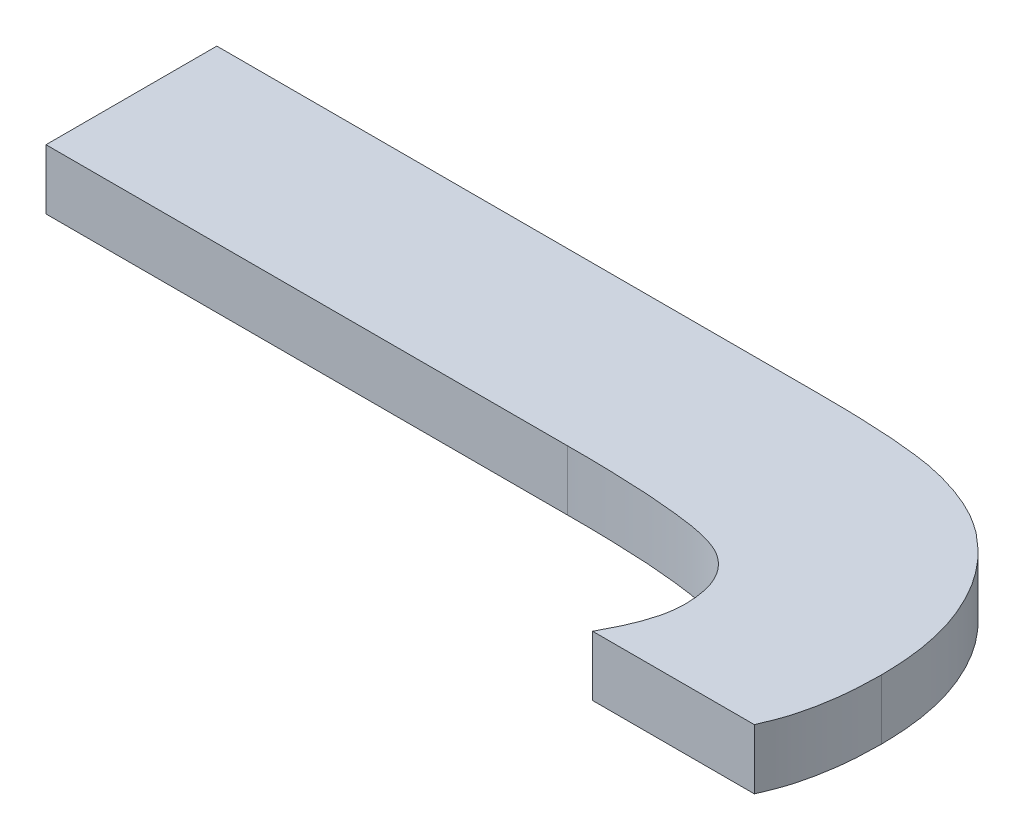
ISO-10303-21;
HEADER;
FILE_DESCRIPTION(('STEP AP214'),'2;1');
FILE_NAME('part.step','',(''),(''),'','','');
FILE_SCHEMA(('AUTOMOTIVE_DESIGN { 1 0 10303 214 1 1 1 1 }'));
ENDSEC;
DATA;
#1=APPLICATION_CONTEXT('core data for automotive mechanical design processes');
#2=APPLICATION_PROTOCOL_DEFINITION('international standard','automotive_design',2000,#1);
#3=PRODUCT_CONTEXT('',#1,'mechanical');
#4=PRODUCT('Part','Part','',(#3));
#5=PRODUCT_RELATED_PRODUCT_CATEGORY('part','',(#4));
#6=PRODUCT_DEFINITION_FORMATION('','',#4);
#7=PRODUCT_DEFINITION_CONTEXT('part definition',#1,'design');
#8=PRODUCT_DEFINITION('design','',#6,#7);
#9=PRODUCT_DEFINITION_SHAPE('','',#8);
#10=(LENGTH_UNIT() NAMED_UNIT(*) SI_UNIT(.MILLI.,.METRE.));
#11=(NAMED_UNIT(*) PLANE_ANGLE_UNIT() SI_UNIT($,.RADIAN.));
#12=(NAMED_UNIT(*) SI_UNIT($,.STERADIAN.) SOLID_ANGLE_UNIT());
#13=UNCERTAINTY_MEASURE_WITH_UNIT(LENGTH_MEASURE(1.E-05),#10,'distance_accuracy_value','');
#14=(GEOMETRIC_REPRESENTATION_CONTEXT(3) GLOBAL_UNCERTAINTY_ASSIGNED_CONTEXT((#13)) GLOBAL_UNIT_ASSIGNED_CONTEXT((#10,
#11,#12)) REPRESENTATION_CONTEXT('',''));
#15=CARTESIAN_POINT('',(0.,0.,0.));
#16=DIRECTION('',(0.,0.,1.));
#17=DIRECTION('',(1.,0.,0.));
#18=AXIS2_PLACEMENT_3D('',#15,#16,#17);
#19=CARTESIAN_POINT('',(2.55,2.9956,3.3134212662338));
#20=CARTESIAN_POINT('',(2.55,2.9306,3.3134212662338));
#21=CARTESIAN_POINT('',(2.5497738477725,2.9956,3.3242334318502));
#22=CARTESIAN_POINT('',(2.5497738477725,2.9306,3.3242334318502));
#23=CARTESIAN_POINT('',(2.5493331390078,2.9956,3.3453033819643));
#24=CARTESIAN_POINT('',(2.5493331390078,2.9306,3.3453033819643));
#25=CARTESIAN_POINT('',(2.5449993435722,2.9956,3.3755794132263));
#26=CARTESIAN_POINT('',(2.5449993435722,2.9306,3.3755794132263));
#27=CARTESIAN_POINT('',(2.5383596005113,2.9956,3.4035173618713));
#28=CARTESIAN_POINT('',(2.5383596005113,2.9306,3.4035173618713));
#29=CARTESIAN_POINT('',(2.5312649905346,2.9956,3.4204869664525));
#30=CARTESIAN_POINT('',(2.5312649905346,2.9306,3.4204869664525));
#31=CARTESIAN_POINT('',(2.527830762987,2.9956,3.4287012987013));
#32=CARTESIAN_POINT('',(2.527830762987,2.9306,3.4287012987013));
#33=B_SPLINE_SURFACE_WITH_KNOTS('',3,1,((#19,#20),(#21,#22),(#23,#24),(#25,#26),(#27,#28),(#29,
#30),(#31,#32)),.UNSPECIFIED.,.F.,.F.,.F.,(4,1,1,1,4),(2,2),(0.,0.274083863078505,
0.534114397341478,0.774482716327897,1.),(0.,1.),.UNSPECIFIED.);
#34=CARTESIAN_POINT('',(2.55,2.9306,3.3134212662338));
#35=CARTESIAN_POINT('',(2.5497738477725,2.9306,3.3242334318502));
#36=CARTESIAN_POINT('',(2.5493331390078,2.9306,3.3453033819643));
#37=CARTESIAN_POINT('',(2.5449993435722,2.9306,3.3755794132263));
#38=CARTESIAN_POINT('',(2.5383596005113,2.9306,3.4035173618713));
#39=CARTESIAN_POINT('',(2.5312649905346,2.9306,3.4204869664525));
#40=CARTESIAN_POINT('',(2.527830762987,2.9306,3.4287012987013));
#41=B_SPLINE_CURVE_WITH_KNOTS('',3,(#34,#35,#36,#37,#38,#39,#40),.UNSPECIFIED.,.F.,.F.,(4,1,1,1,
4),(0.,0.274083863078505,0.534114397341478,0.774482716327897,1.),.UNSPECIFIED.);
#42=CARTESIAN_POINT('',(2.55,2.9306,3.3134212662338));
#43=VERTEX_POINT('',#42);
#44=CARTESIAN_POINT('',(2.527830762987,2.9306,3.4287012987013));
#45=VERTEX_POINT('',#44);
#46=EDGE_CURVE('E11',#43,#45,#41,.T.);
#47=DIRECTION('',(0.,-1.,0.));
#48=VECTOR('',#47,1.);
#49=CARTESIAN_POINT('',(2.55,2.9956,3.3134212662338));
#50=LINE('',#49,#48);
#51=CARTESIAN_POINT('',(2.55,2.9956,3.3134212662338));
#52=VERTEX_POINT('',#51);
#53=EDGE_CURVE('E28',#52,#43,#50,.T.);
#54=CARTESIAN_POINT('',(2.55,2.9956,3.3134212662338));
#55=CARTESIAN_POINT('',(2.5497738477725,2.9956,3.3242334318502));
#56=CARTESIAN_POINT('',(2.5493331390078,2.9956,3.3453033819643));
#57=CARTESIAN_POINT('',(2.5449993435722,2.9956,3.3755794132263));
#58=CARTESIAN_POINT('',(2.5383596005113,2.9956,3.4035173618713));
#59=CARTESIAN_POINT('',(2.5312649905346,2.9956,3.4204869664525));
#60=CARTESIAN_POINT('',(2.527830762987,2.9956,3.4287012987013));
#61=B_SPLINE_CURVE_WITH_KNOTS('',3,(#54,#55,#56,#57,#58,#59,#60),.UNSPECIFIED.,.F.,.F.,(4,1,1,1,
4),(0.,0.274083863078505,0.534114397341478,0.774482716327897,1.),.UNSPECIFIED.);
#62=CARTESIAN_POINT('',(2.527830762987,2.9956,3.4287012987013));
#63=VERTEX_POINT('',#62);
#64=EDGE_CURVE('E208',#52,#63,#61,.T.);
#65=DIRECTION('',(0.,-1.,0.));
#66=VECTOR('',#65,1.);
#67=CARTESIAN_POINT('',(2.527830762987,2.9956,3.4287012987013));
#68=LINE('',#67,#66);
#69=EDGE_CURVE('E112',#63,#45,#68,.T.);
#70=ORIENTED_EDGE('',*,*,#46,.F.);
#71=ORIENTED_EDGE('',*,*,#53,.F.);
#72=ORIENTED_EDGE('',*,*,#64,.T.);
#73=ORIENTED_EDGE('',*,*,#69,.T.);
#74=EDGE_LOOP('',(#70,#71,#72,#73));
#75=FACE_BOUND('',#74,.T.);
#76=ADVANCED_FACE('F17',(#75),#33,.T.);
#77=CARTESIAN_POINT('',(2.4678774350649,2.9956,3.1285491071429));
#78=CARTESIAN_POINT('',(2.4678774350649,2.9306,3.1285491071429));
#79=CARTESIAN_POINT('',(2.4743191460447,2.9956,3.1339870852728));
#80=CARTESIAN_POINT('',(2.4743191460447,2.9306,3.1339870852728));
#81=CARTESIAN_POINT('',(2.4871331745617,2.9956,3.1448044608196));
#82=CARTESIAN_POINT('',(2.4871331745617,2.9306,3.1448044608196));
#83=CARTESIAN_POINT('',(2.5037491170381,2.9956,3.1637072406119));
#84=CARTESIAN_POINT('',(2.5037491170381,2.9306,3.1637072406119));
#85=CARTESIAN_POINT('',(2.5179095832179,2.9956,3.1844372915379));
#86=CARTESIAN_POINT('',(2.5179095832179,2.9306,3.1844372915379));
#87=CARTESIAN_POINT('',(2.5294765633289,2.9956,3.2070220364225));
#88=CARTESIAN_POINT('',(2.5294765633289,2.9306,3.2070220364225));
#89=CARTESIAN_POINT('',(2.5388495601437,2.9956,3.231206065738));
#90=CARTESIAN_POINT('',(2.5388495601437,2.9306,3.231206065738));
#91=CARTESIAN_POINT('',(2.5453179605092,2.9956,3.2571736884856));
#92=CARTESIAN_POINT('',(2.5453179605092,2.9306,3.2571736884856));
#93=CARTESIAN_POINT('',(2.5492316871639,2.9956,3.2847710122562));
#94=CARTESIAN_POINT('',(2.5492316871639,2.9306,3.2847710122562));
#95=CARTESIAN_POINT('',(2.5497394366337,2.9956,3.3037049029635));
#96=CARTESIAN_POINT('',(2.5497394366337,2.9306,3.3037049029635));
#97=CARTESIAN_POINT('',(2.55,2.9956,3.3134212662338));
#98=CARTESIAN_POINT('',(2.55,2.9306,3.3134212662338));
#99=B_SPLINE_SURFACE_WITH_KNOTS('',3,1,((#77,#78),(#79,#80),(#81,#82),(#83,#84),(#85,#86),(#87,
#88),(#89,#90),(#91,#92),(#93,#94),(#95,#96),(#97,#98)),.UNSPECIFIED.,.F.,.F.,.F.,(4,1,1,1,1,1,
1,1,4),(2,2),(0.,0.120499939259771,0.239701790845742,0.358807845235199,0.478896598669107,
0.60202033229508,0.729141189105166,0.861002546053464,1.),(0.,1.),.UNSPECIFIED.);
#100=CARTESIAN_POINT('',(2.4678774350649,2.9306,3.1285491071429));
#101=CARTESIAN_POINT('',(2.4743191460447,2.9306,3.1339870852728));
#102=CARTESIAN_POINT('',(2.4871331745617,2.9306,3.1448044608196));
#103=CARTESIAN_POINT('',(2.5037491170381,2.9306,3.1637072406119));
#104=CARTESIAN_POINT('',(2.5179095832179,2.9306,3.1844372915379));
#105=CARTESIAN_POINT('',(2.5294765633289,2.9306,3.2070220364225));
#106=CARTESIAN_POINT('',(2.5388495601437,2.9306,3.231206065738));
#107=CARTESIAN_POINT('',(2.5453179605092,2.9306,3.2571736884856));
#108=CARTESIAN_POINT('',(2.5492316871639,2.9306,3.2847710122562));
#109=CARTESIAN_POINT('',(2.5497394366337,2.9306,3.3037049029635));
#110=CARTESIAN_POINT('',(2.55,2.9306,3.3134212662338));
#111=B_SPLINE_CURVE_WITH_KNOTS('',3,(#100,#101,#102,#103,#104,#105,#106,#107,#108,#109,#110),
.UNSPECIFIED.,.F.,.F.,(4,1,1,1,1,1,1,1,4),(0.,0.120499939259771,0.239701790845742,
0.358807845235199,0.478896598669107,0.60202033229508,0.729141189105166,0.861002546053464,1.),.UNSPECIFIED.);
#112=CARTESIAN_POINT('',(2.4678774350649,2.9306,3.1285491071429));
#113=VERTEX_POINT('',#112);
#114=EDGE_CURVE('E200',#113,#43,#111,.T.);
#115=DIRECTION('',(0.,-1.,0.));
#116=VECTOR('',#115,1.);
#117=CARTESIAN_POINT('',(2.4678774350649,2.9956,3.1285491071429));
#118=LINE('',#117,#116);
#119=CARTESIAN_POINT('',(2.4678774350649,2.9956,3.1285491071429));
#120=VERTEX_POINT('',#119);
#121=EDGE_CURVE('E194',#120,#113,#118,.T.);
#122=CARTESIAN_POINT('',(2.4678774350649,2.9956,3.1285491071429));
#123=CARTESIAN_POINT('',(2.4743191460447,2.9956,3.1339870852728));
#124=CARTESIAN_POINT('',(2.4871331745617,2.9956,3.1448044608196));
#125=CARTESIAN_POINT('',(2.5037491170381,2.9956,3.1637072406119));
#126=CARTESIAN_POINT('',(2.5179095832179,2.9956,3.1844372915379));
#127=CARTESIAN_POINT('',(2.5294765633289,2.9956,3.2070220364225));
#128=CARTESIAN_POINT('',(2.5388495601437,2.9956,3.231206065738));
#129=CARTESIAN_POINT('',(2.5453179605092,2.9956,3.2571736884856));
#130=CARTESIAN_POINT('',(2.5492316871639,2.9956,3.2847710122562));
#131=CARTESIAN_POINT('',(2.5497394366337,2.9956,3.3037049029635));
#132=CARTESIAN_POINT('',(2.55,2.9956,3.3134212662338));
#133=B_SPLINE_CURVE_WITH_KNOTS('',3,(#122,#123,#124,#125,#126,#127,#128,#129,#130,#131,#132),
.UNSPECIFIED.,.F.,.F.,(4,1,1,1,1,1,1,1,4),(0.,0.120499939259771,0.239701790845742,
0.358807845235199,0.478896598669107,0.60202033229508,0.729141189105166,0.861002546053464,1.),.UNSPECIFIED.);
#134=EDGE_CURVE('E186',#120,#52,#133,.T.);
#135=ORIENTED_EDGE('',*,*,#114,.F.);
#136=ORIENTED_EDGE('',*,*,#121,.F.);
#137=ORIENTED_EDGE('',*,*,#134,.T.);
#138=ORIENTED_EDGE('',*,*,#53,.T.);
#139=EDGE_LOOP('',(#135,#136,#137,#138));
#140=FACE_BOUND('',#139,.T.);
#141=ADVANCED_FACE('F215',(#140),#99,.T.);
#142=CARTESIAN_POINT('',(2.2486911525974,2.9956,3.0832467532468));
#143=CARTESIAN_POINT('',(2.2486911525974,2.9306,3.0832467532468));
#144=CARTESIAN_POINT('',(2.2565303119496,2.9956,3.0833092628335));
#145=CARTESIAN_POINT('',(2.2565303119496,2.9306,3.0833092628335));
#146=CARTESIAN_POINT('',(2.2716312252471,2.9956,3.0834296777667));
#147=CARTESIAN_POINT('',(2.2716312252471,2.9306,3.0834296777667));
#148=CARTESIAN_POINT('',(2.2934927693526,2.9956,3.0836321314618));
#149=CARTESIAN_POINT('',(2.2934927693526,2.9306,3.0836321314618));
#150=CARTESIAN_POINT('',(2.3136541484801,2.9956,3.0848295199475));
#151=CARTESIAN_POINT('',(2.3136541484801,2.9306,3.0848295199475));
#152=CARTESIAN_POINT('',(2.3322558074335,2.9956,3.0855383932958));
#153=CARTESIAN_POINT('',(2.3322558074335,2.9306,3.0855383932958));
#154=CARTESIAN_POINT('',(2.3491430171471,2.9956,3.0872146790696));
#155=CARTESIAN_POINT('',(2.3491430171471,2.9306,3.0872146790696));
#156=CARTESIAN_POINT('',(2.3644590518641,2.9956,3.0888613273748));
#157=CARTESIAN_POINT('',(2.3644590518641,2.9306,3.0888613273748));
#158=CARTESIAN_POINT('',(2.3781067337934,2.9956,3.0909327495814));
#159=CARTESIAN_POINT('',(2.3781067337934,2.9306,3.0909327495814));
#160=CARTESIAN_POINT('',(2.3939409895835,2.9956,3.0942561483369));
#161=CARTESIAN_POINT('',(2.3939409895835,2.9306,3.0942561483369));
#162=CARTESIAN_POINT('',(2.4119544457882,2.9956,3.099435261028));
#163=CARTESIAN_POINT('',(2.4119544457882,2.9306,3.099435261028));
#164=CARTESIAN_POINT('',(2.4322224741531,2.9956,3.1071288007434));
#165=CARTESIAN_POINT('',(2.4322224741531,2.9306,3.1071288007434));
#166=CARTESIAN_POINT('',(2.4510054390737,2.9956,3.1166423314599));
#167=CARTESIAN_POINT('',(2.4510054390737,2.9306,3.1166423314599));
#168=CARTESIAN_POINT('',(2.4623091511469,2.9956,3.1246195004985));
#169=CARTESIAN_POINT('',(2.4623091511469,2.9306,3.1246195004985));
#170=CARTESIAN_POINT('',(2.4678774350649,2.9956,3.1285491071429));
#171=CARTESIAN_POINT('',(2.4678774350649,2.9306,3.1285491071429));
#172=B_SPLINE_SURFACE_WITH_KNOTS('',3,1,((#142,#143),(#144,#145),(#146,#147),(#148,#149),(#150,
#151),(#152,#153),(#154,#155),(#156,#157),(#158,#159),(#160,#161),(#162,#163),(#164,#165),(#166,
#167),(#168,#169),(#170,#171)),.UNSPECIFIED.,.F.,.F.,.F.,(4,1,1,1,1,1,1,1,1,1,1,1,4),(2,2),(0.,
0.103189947433387,0.198779279685321,0.287687949097263,0.368993923108795,0.443730443517813,
0.510980122796107,0.571747707053025,0.625327070740927,0.72384627359423,0.818090298132923,
0.910390068247318,1.),(0.,1.),.UNSPECIFIED.);
#173=CARTESIAN_POINT('',(2.2486911525974,2.9306,3.0832467532468));
#174=CARTESIAN_POINT('',(2.2565303119496,2.9306,3.0833092628335));
#175=CARTESIAN_POINT('',(2.2716312252471,2.9306,3.0834296777667));
#176=CARTESIAN_POINT('',(2.2934927693526,2.9306,3.0836321314618));
#177=CARTESIAN_POINT('',(2.3136541484801,2.9306,3.0848295199475));
#178=CARTESIAN_POINT('',(2.3322558074335,2.9306,3.0855383932958));
#179=CARTESIAN_POINT('',(2.3491430171471,2.9306,3.0872146790696));
#180=CARTESIAN_POINT('',(2.3644590518641,2.9306,3.0888613273748));
#181=CARTESIAN_POINT('',(2.3781067337934,2.9306,3.0909327495814));
#182=CARTESIAN_POINT('',(2.3939409895835,2.9306,3.0942561483369));
#183=CARTESIAN_POINT('',(2.4119544457882,2.9306,3.099435261028));
#184=CARTESIAN_POINT('',(2.4322224741531,2.9306,3.1071288007434));
#185=CARTESIAN_POINT('',(2.4510054390737,2.9306,3.1166423314599));
#186=CARTESIAN_POINT('',(2.4623091511469,2.9306,3.1246195004985));
#187=CARTESIAN_POINT('',(2.4678774350649,2.9306,3.1285491071429));
#188=B_SPLINE_CURVE_WITH_KNOTS('',3,(#173,#174,#175,#176,#177,#178,#179,#180,#181,#182,#183,
#184,#185,#186,#187),.UNSPECIFIED.,.F.,.F.,(4,1,1,1,1,1,1,1,1,1,1,1,4),(0.,0.103189947433387,
0.198779279685321,0.287687949097263,0.368993923108795,0.443730443517813,0.510980122796107,
0.571747707053025,0.625327070740927,0.72384627359423,0.818090298132923,0.910390068247318,1.),.UNSPECIFIED.);
#189=CARTESIAN_POINT('',(2.2486911525974,2.9306,3.0832467532468));
#190=VERTEX_POINT('',#189);
#191=EDGE_CURVE('E181',#190,#113,#188,.T.);
#192=DIRECTION('',(0.,-1.,0.));
#193=VECTOR('',#192,1.);
#194=CARTESIAN_POINT('',(2.2486911525974,2.9956,3.0832467532468));
#195=LINE('',#194,#193);
#196=CARTESIAN_POINT('',(2.2486911525974,2.9956,3.0832467532468));
#197=VERTEX_POINT('',#196);
#198=EDGE_CURVE('E175',#197,#190,#195,.T.);
#199=CARTESIAN_POINT('',(2.2486911525974,2.9956,3.0832467532468));
#200=CARTESIAN_POINT('',(2.2565303119496,2.9956,3.0833092628335));
#201=CARTESIAN_POINT('',(2.2716312252471,2.9956,3.0834296777667));
#202=CARTESIAN_POINT('',(2.2934927693526,2.9956,3.0836321314618));
#203=CARTESIAN_POINT('',(2.3136541484801,2.9956,3.0848295199475));
#204=CARTESIAN_POINT('',(2.3322558074335,2.9956,3.0855383932958));
#205=CARTESIAN_POINT('',(2.3491430171471,2.9956,3.0872146790696));
#206=CARTESIAN_POINT('',(2.3644590518641,2.9956,3.0888613273748));
#207=CARTESIAN_POINT('',(2.3781067337934,2.9956,3.0909327495814));
#208=CARTESIAN_POINT('',(2.3939409895835,2.9956,3.0942561483369));
#209=CARTESIAN_POINT('',(2.4119544457882,2.9956,3.099435261028));
#210=CARTESIAN_POINT('',(2.4322224741531,2.9956,3.1071288007434));
#211=CARTESIAN_POINT('',(2.4510054390737,2.9956,3.1166423314599));
#212=CARTESIAN_POINT('',(2.4623091511469,2.9956,3.1246195004985));
#213=CARTESIAN_POINT('',(2.4678774350649,2.9956,3.1285491071429));
#214=B_SPLINE_CURVE_WITH_KNOTS('',3,(#199,#200,#201,#202,#203,#204,#205,#206,#207,#208,#209,
#210,#211,#212,#213),.UNSPECIFIED.,.F.,.F.,(4,1,1,1,1,1,1,1,1,1,1,1,4),(0.,0.103189947433387,
0.198779279685321,0.287687949097263,0.368993923108795,0.443730443517813,0.510980122796107,
0.571747707053025,0.625327070740927,0.72384627359423,0.818090298132923,0.910390068247318,1.),.UNSPECIFIED.);
#215=EDGE_CURVE('E170',#197,#120,#214,.T.);
#216=ORIENTED_EDGE('',*,*,#191,.F.);
#217=ORIENTED_EDGE('',*,*,#198,.F.);
#218=ORIENTED_EDGE('',*,*,#215,.T.);
#219=ORIENTED_EDGE('',*,*,#121,.T.);
#220=EDGE_LOOP('',(#216,#217,#218,#219));
#221=FACE_BOUND('',#220,.T.);
#222=ADVANCED_FACE('F219',(#221),#172,.T.);
#223=CARTESIAN_POINT('',(1.6,2.9956,3.0832467532468));
#224=DIRECTION('',(0.,0.,-1.));
#225=DIRECTION('',(0.,1.,0.));
#226=AXIS2_PLACEMENT_3D('',#223,#224,#225);
#227=PLANE('',#226);
#228=DIRECTION('',(1.,0.,0.));
#229=VECTOR('',#228,1.);
#230=CARTESIAN_POINT('',(1.6,2.9306,3.0832467532468));
#231=LINE('',#230,#229);
#232=CARTESIAN_POINT('',(1.6,2.9306,3.0832467532468));
#233=VERTEX_POINT('',#232);
#234=EDGE_CURVE('E167',#233,#190,#231,.T.);
#235=ORIENTED_EDGE('',*,*,#234,.F.);
#236=DIRECTION('',(0.,-1.,0.));
#237=VECTOR('',#236,1.);
#238=CARTESIAN_POINT('',(1.6,2.9956,3.0832467532468));
#239=LINE('',#238,#237);
#240=CARTESIAN_POINT('',(1.6,2.9956,3.0832467532468));
#241=VERTEX_POINT('',#240);
#242=EDGE_CURVE('E164',#241,#233,#239,.T.);
#243=ORIENTED_EDGE('',*,*,#242,.F.);
#244=DIRECTION('',(1.,0.,0.));
#245=VECTOR('',#244,1.);
#246=CARTESIAN_POINT('',(1.6,2.9956,3.0832467532468));
#247=LINE('',#246,#245);
#248=EDGE_CURVE('E161',#241,#197,#247,.T.);
#249=ORIENTED_EDGE('',*,*,#248,.T.);
#250=ORIENTED_EDGE('',*,*,#198,.T.);
#251=EDGE_LOOP('',(#235,#243,#249,#250));
#252=FACE_BOUND('',#251,.T.);
#253=ADVANCED_FACE('F222',(#252),#227,.T.);
#254=CARTESIAN_POINT('',(1.6,2.9956,3.2683116883117));
#255=DIRECTION('',(-1.,0.,0.));
#256=DIRECTION('',(0.,1.,0.));
#257=AXIS2_PLACEMENT_3D('',#254,#255,#256);
#258=PLANE('',#257);
#259=DIRECTION('',(0.,0.,-1.));
#260=VECTOR('',#259,1.);
#261=CARTESIAN_POINT('',(1.6,2.9306,3.2683116883117));
#262=LINE('',#261,#260);
#263=CARTESIAN_POINT('',(1.6,2.9306,3.2683116883117));
#264=VERTEX_POINT('',#263);
#265=EDGE_CURVE('E158',#264,#233,#262,.T.);
#266=ORIENTED_EDGE('',*,*,#265,.F.);
#267=DIRECTION('',(0.,-1.,0.));
#268=VECTOR('',#267,1.);
#269=CARTESIAN_POINT('',(1.6,2.9956,3.2683116883117));
#270=LINE('',#269,#268);
#271=CARTESIAN_POINT('',(1.6,2.9956,3.2683116883117));
#272=VERTEX_POINT('',#271);
#273=EDGE_CURVE('E155',#272,#264,#270,.T.);
#274=ORIENTED_EDGE('',*,*,#273,.F.);
#275=DIRECTION('',(0.,0.,-1.));
#276=VECTOR('',#275,1.);
#277=CARTESIAN_POINT('',(1.6,2.9956,3.2683116883117));
#278=LINE('',#277,#276);
#279=EDGE_CURVE('E152',#272,#241,#278,.T.);
#280=ORIENTED_EDGE('',*,*,#279,.T.);
#281=ORIENTED_EDGE('',*,*,#242,.T.);
#282=EDGE_LOOP('',(#266,#274,#280,#281));
#283=FACE_BOUND('',#282,.T.);
#284=ADVANCED_FACE('F226',(#283),#258,.T.);
#285=CARTESIAN_POINT('',(2.1652191558442,2.9956,3.2683116883117));
#286=DIRECTION('',(0.,0.,1.));
#287=DIRECTION('',(0.,-1.,0.));
#288=AXIS2_PLACEMENT_3D('',#285,#286,#287);
#289=PLANE('',#288);
#290=DIRECTION('',(-1.,0.,0.));
#291=VECTOR('',#290,1.);
#292=CARTESIAN_POINT('',(2.1652191558442,2.9306,3.2683116883117));
#293=LINE('',#292,#291);
#294=CARTESIAN_POINT('',(2.1652191558442,2.9306,3.2683116883117));
#295=VERTEX_POINT('',#294);
#296=EDGE_CURVE('E149',#295,#264,#293,.T.);
#297=ORIENTED_EDGE('',*,*,#296,.F.);
#298=DIRECTION('',(0.,-1.,0.));
#299=VECTOR('',#298,1.);
#300=CARTESIAN_POINT('',(2.1652191558442,2.9956,3.2683116883117));
#301=LINE('',#300,#299);
#302=CARTESIAN_POINT('',(2.1652191558442,2.9956,3.2683116883117));
#303=VERTEX_POINT('',#302);
#304=EDGE_CURVE('E146',#303,#295,#301,.T.);
#305=ORIENTED_EDGE('',*,*,#304,.F.);
#306=DIRECTION('',(-1.,0.,0.));
#307=VECTOR('',#306,1.);
#308=CARTESIAN_POINT('',(2.1652191558442,2.9956,3.2683116883117));
#309=LINE('',#308,#307);
#310=EDGE_CURVE('E140',#303,#272,#309,.T.);
#311=ORIENTED_EDGE('',*,*,#310,.T.);
#312=ORIENTED_EDGE('',*,*,#273,.T.);
#313=EDGE_LOOP('',(#297,#305,#311,#312));
#314=FACE_BOUND('',#313,.T.);
#315=ADVANCED_FACE('F228',(#314),#289,.T.);
#316=CARTESIAN_POINT('',(2.3772727272727,2.9956,3.3539042207792));
#317=CARTESIAN_POINT('',(2.3772727272727,2.9306,3.3539042207792));
#318=CARTESIAN_POINT('',(2.3771545256871,2.9956,3.3499790381662));
#319=CARTESIAN_POINT('',(2.3771545256871,2.9306,3.3499790381662));
#320=CARTESIAN_POINT('',(2.3769268418107,2.9956,3.3424182191803));
#321=CARTESIAN_POINT('',(2.3769268418107,2.9306,3.3424182191803));
#322=CARTESIAN_POINT('',(2.3753848534838,2.9956,3.3314840731211));
#323=CARTESIAN_POINT('',(2.3753848534838,2.9306,3.3314840731211));
#324=CARTESIAN_POINT('',(2.3727871750898,2.9956,3.3214595724361));
#325=CARTESIAN_POINT('',(2.3727871750898,2.9306,3.3214595724361));
#326=CARTESIAN_POINT('',(2.3688330331462,2.9956,3.3124920516251));
#327=CARTESIAN_POINT('',(2.3688330331462,2.9306,3.3124920516251));
#328=CARTESIAN_POINT('',(2.3640228656121,2.9956,3.304418886642));
#329=CARTESIAN_POINT('',(2.3640228656121,2.9306,3.304418886642));
#330=CARTESIAN_POINT('',(2.3579520873319,2.9956,3.2974591635165));
#331=CARTESIAN_POINT('',(2.3579520873319,2.9306,3.2974591635165));
#332=CARTESIAN_POINT('',(2.3509126241766,2.9956,3.2913716292753));
#333=CARTESIAN_POINT('',(2.3509126241766,2.9306,3.2913716292753));
#334=CARTESIAN_POINT('',(2.3423985963194,2.9956,3.2860705919726));
#335=CARTESIAN_POINT('',(2.3423985963194,2.9306,3.2860705919726));
#336=CARTESIAN_POINT('',(2.3314696174775,2.9956,3.2818786611108));
#337=CARTESIAN_POINT('',(2.3314696174775,2.9306,3.2818786611108));
#338=CARTESIAN_POINT('',(2.3177469077157,2.9956,3.2780411426612));
#339=CARTESIAN_POINT('',(2.3177469077157,2.9306,3.2780411426612));
#340=CARTESIAN_POINT('',(2.3005574428477,2.9956,3.2751025814297));
#341=CARTESIAN_POINT('',(2.3005574428477,2.9306,3.2751025814297));
#342=CARTESIAN_POINT('',(2.2800196922305,2.9956,3.2727473985971));
#343=CARTESIAN_POINT('',(2.2800196922305,2.9306,3.2727473985971));
#344=CARTESIAN_POINT('',(2.2561177279651,2.9956,3.2705261147333));
#345=CARTESIAN_POINT('',(2.2561177279651,2.9306,3.2705261147333));
#346=CARTESIAN_POINT('',(2.2288423226587,2.9956,3.269400701635));
#347=CARTESIAN_POINT('',(2.2288423226587,2.9306,3.269400701635));
#348=CARTESIAN_POINT('',(2.1981928001753,2.9956,3.2682813817341));
#349=CARTESIAN_POINT('',(2.1981928001753,2.9306,3.2682813817341));
#350=CARTESIAN_POINT('',(2.1765943407781,2.9956,3.2683012332063));
#351=CARTESIAN_POINT('',(2.1765943407781,2.9306,3.2683012332063));
#352=CARTESIAN_POINT('',(2.1652191558442,2.9956,3.2683116883117));
#353=CARTESIAN_POINT('',(2.1652191558442,2.9306,3.2683116883117));
#354=B_SPLINE_SURFACE_WITH_KNOTS('',3,1,((#316,#317),(#318,#319),(#320,#321),(#322,#323),(#324,
#325),(#326,#327),(#328,#329),(#330,#331),(#332,#333),(#334,#335),(#336,#337),(#338,#339),(#340,
#341),(#342,#343),(#344,#345),(#346,#347),(#348,#349),(#350,#351),(#352,#353)),.UNSPECIFIED.,
.F.,.F.,.F.,(4,1,1,1,1,1,1,1,1,1,1,1,1,1,1,1,4),(2,2),(0.,0.0454035573864295,0.0874578618515766,
0.127492366968012,0.16478222962574,0.20048197486491,0.235800393089218,0.271118811313527,
0.307841153961921,0.351189738792344,0.406026882839916,0.472520576601945,0.552651685262186,
0.645198032484068,0.75014964479342,0.868412188849988,1.),(0.,1.),.UNSPECIFIED.);
#355=CARTESIAN_POINT('',(2.3772727272727,2.9306,3.3539042207792));
#356=CARTESIAN_POINT('',(2.3771545256871,2.9306,3.3499790381662));
#357=CARTESIAN_POINT('',(2.3769268418107,2.9306,3.3424182191803));
#358=CARTESIAN_POINT('',(2.3753848534838,2.9306,3.3314840731211));
#359=CARTESIAN_POINT('',(2.3727871750898,2.9306,3.3214595724361));
#360=CARTESIAN_POINT('',(2.3688330331462,2.9306,3.3124920516251));
#361=CARTESIAN_POINT('',(2.3640228656121,2.9306,3.304418886642));
#362=CARTESIAN_POINT('',(2.3579520873319,2.9306,3.2974591635165));
#363=CARTESIAN_POINT('',(2.3509126241766,2.9306,3.2913716292753));
#364=CARTESIAN_POINT('',(2.3423985963194,2.9306,3.2860705919726));
#365=CARTESIAN_POINT('',(2.3314696174775,2.9306,3.2818786611108));
#366=CARTESIAN_POINT('',(2.3177469077157,2.9306,3.2780411426612));
#367=CARTESIAN_POINT('',(2.3005574428477,2.9306,3.2751025814297));
#368=CARTESIAN_POINT('',(2.2800196922305,2.9306,3.2727473985971));
#369=CARTESIAN_POINT('',(2.2561177279651,2.9306,3.2705261147333));
#370=CARTESIAN_POINT('',(2.2288423226587,2.9306,3.269400701635));
#371=CARTESIAN_POINT('',(2.1981928001753,2.9306,3.2682813817341));
#372=CARTESIAN_POINT('',(2.1765943407781,2.9306,3.2683012332063));
#373=CARTESIAN_POINT('',(2.1652191558442,2.9306,3.2683116883117));
#374=B_SPLINE_CURVE_WITH_KNOTS('',3,(#355,#356,#357,#358,#359,#360,#361,#362,#363,#364,#365,
#366,#367,#368,#369,#370,#371,#372,#373),.UNSPECIFIED.,.F.,.F.,(4,1,1,1,1,1,1,1,1,1,1,1,1,1,1,1,
4),(0.,0.0454035573864295,0.0874578618515766,0.127492366968012,0.16478222962574,
0.20048197486491,0.235800393089218,0.271118811313527,0.307841153961921,0.351189738792344,
0.406026882839916,0.472520576601945,0.552651685262186,0.645198032484068,0.75014964479342,
0.868412188849988,1.),.UNSPECIFIED.);
#375=CARTESIAN_POINT('',(2.3772727272727,2.9306,3.3539042207792));
#376=VERTEX_POINT('',#375);
#377=EDGE_CURVE('E135',#376,#295,#374,.T.);
#378=DIRECTION('',(0.,-1.,0.));
#379=VECTOR('',#378,1.);
#380=CARTESIAN_POINT('',(2.3772727272727,2.9956,3.3539042207792));
#381=LINE('',#380,#379);
#382=CARTESIAN_POINT('',(2.3772727272727,2.9956,3.3539042207792));
#383=VERTEX_POINT('',#382);
#384=EDGE_CURVE('E130',#383,#376,#381,.T.);
#385=CARTESIAN_POINT('',(2.3772727272727,2.9956,3.3539042207792));
#386=CARTESIAN_POINT('',(2.3771545256871,2.9956,3.3499790381662));
#387=CARTESIAN_POINT('',(2.3769268418107,2.9956,3.3424182191803));
#388=CARTESIAN_POINT('',(2.3753848534838,2.9956,3.3314840731211));
#389=CARTESIAN_POINT('',(2.3727871750898,2.9956,3.3214595724361));
#390=CARTESIAN_POINT('',(2.3688330331462,2.9956,3.3124920516251));
#391=CARTESIAN_POINT('',(2.3640228656121,2.9956,3.304418886642));
#392=CARTESIAN_POINT('',(2.3579520873319,2.9956,3.2974591635165));
#393=CARTESIAN_POINT('',(2.3509126241766,2.9956,3.2913716292753));
#394=CARTESIAN_POINT('',(2.3423985963194,2.9956,3.2860705919726));
#395=CARTESIAN_POINT('',(2.3314696174775,2.9956,3.2818786611108));
#396=CARTESIAN_POINT('',(2.3177469077157,2.9956,3.2780411426612));
#397=CARTESIAN_POINT('',(2.3005574428477,2.9956,3.2751025814297));
#398=CARTESIAN_POINT('',(2.2800196922305,2.9956,3.2727473985971));
#399=CARTESIAN_POINT('',(2.2561177279651,2.9956,3.2705261147333));
#400=CARTESIAN_POINT('',(2.2288423226587,2.9956,3.269400701635));
#401=CARTESIAN_POINT('',(2.1981928001753,2.9956,3.2682813817341));
#402=CARTESIAN_POINT('',(2.1765943407781,2.9956,3.2683012332063));
#403=CARTESIAN_POINT('',(2.1652191558442,2.9956,3.2683116883117));
#404=B_SPLINE_CURVE_WITH_KNOTS('',3,(#385,#386,#387,#388,#389,#390,#391,#392,#393,#394,#395,
#396,#397,#398,#399,#400,#401,#402,#403),.UNSPECIFIED.,.F.,.F.,(4,1,1,1,1,1,1,1,1,1,1,1,1,1,1,1,
4),(0.,0.0454035573864295,0.0874578618515766,0.127492366968012,0.16478222962574,
0.20048197486491,0.235800393089218,0.271118811313527,0.307841153961921,0.351189738792344,
0.406026882839916,0.472520576601945,0.552651685262186,0.645198032484068,0.75014964479342,
0.868412188849988,1.),.UNSPECIFIED.);
#405=EDGE_CURVE('E107',#383,#303,#404,.T.);
#406=ORIENTED_EDGE('',*,*,#377,.F.);
#407=ORIENTED_EDGE('',*,*,#384,.F.);
#408=ORIENTED_EDGE('',*,*,#405,.T.);
#409=ORIENTED_EDGE('',*,*,#304,.T.);
#410=EDGE_LOOP('',(#406,#407,#408,#409));
#411=FACE_BOUND('',#410,.T.);
#412=ADVANCED_FACE('F230',(#411),#354,.T.);
#413=CARTESIAN_POINT('',(2.3525974025974,2.9956,3.4287012987013));
#414=CARTESIAN_POINT('',(2.3525974025974,2.9306,3.4287012987013));
#415=CARTESIAN_POINT('',(2.3564052484079,2.9956,3.4215078836734));
#416=CARTESIAN_POINT('',(2.3564052484079,2.9306,3.4215078836734));
#417=CARTESIAN_POINT('',(2.3635094812969,2.9956,3.4080872521226));
#418=CARTESIAN_POINT('',(2.3635094812969,2.9306,3.4080872521226));
#419=CARTESIAN_POINT('',(2.3713201937808,2.9956,3.3883421958384));
#420=CARTESIAN_POINT('',(2.3713201937808,2.9306,3.3883421958384));
#421=CARTESIAN_POINT('',(2.3761713580497,2.9956,3.3705222774467));
#422=CARTESIAN_POINT('',(2.3761713580497,2.9306,3.3705222774467));
#423=CARTESIAN_POINT('',(2.3769218883578,2.9956,3.3591978687647));
#424=CARTESIAN_POINT('',(2.3769218883578,2.9306,3.3591978687647));
#425=CARTESIAN_POINT('',(2.3772727272727,2.9956,3.3539042207792));
#426=CARTESIAN_POINT('',(2.3772727272727,2.9306,3.3539042207792));
#427=B_SPLINE_SURFACE_WITH_KNOTS('',3,1,((#413,#414),(#415,#416),(#417,#418),(#419,#420),(#421,
#422),(#423,#424),(#425,#426)),.UNSPECIFIED.,.F.,.F.,.F.,(4,1,1,1,4),(2,2),(0.,
0.306909860600858,0.572596484767601,0.800208220938119,1.),(0.,1.),.UNSPECIFIED.);
#428=CARTESIAN_POINT('',(2.3525974025974,2.9306,3.4287012987013));
#429=CARTESIAN_POINT('',(2.3564052484079,2.9306,3.4215078836734));
#430=CARTESIAN_POINT('',(2.3635094812969,2.9306,3.4080872521226));
#431=CARTESIAN_POINT('',(2.3713201937808,2.9306,3.3883421958384));
#432=CARTESIAN_POINT('',(2.3761713580497,2.9306,3.3705222774467));
#433=CARTESIAN_POINT('',(2.3769218883578,2.9306,3.3591978687647));
#434=CARTESIAN_POINT('',(2.3772727272727,2.9306,3.3539042207792));
#435=B_SPLINE_CURVE_WITH_KNOTS('',3,(#428,#429,#430,#431,#432,#433,#434),.UNSPECIFIED.,.F.,.F.,
(4,1,1,1,4),(0.,0.306909860600858,0.572596484767601,0.800208220938119,1.),.UNSPECIFIED.);
#436=CARTESIAN_POINT('',(2.3525974025974,2.9306,3.4287012987013));
#437=VERTEX_POINT('',#436);
#438=EDGE_CURVE('E94',#437,#376,#435,.T.);
#439=DIRECTION('',(0.,-1.,0.));
#440=VECTOR('',#439,1.);
#441=CARTESIAN_POINT('',(2.3525974025974,2.9956,3.4287012987013));
#442=LINE('',#441,#440);
#443=CARTESIAN_POINT('',(2.3525974025974,2.9956,3.4287012987013));
#444=VERTEX_POINT('',#443);
#445=EDGE_CURVE('E88',#444,#437,#442,.T.);
#446=CARTESIAN_POINT('',(2.3525974025974,2.9956,3.4287012987013));
#447=CARTESIAN_POINT('',(2.3564052484079,2.9956,3.4215078836734));
#448=CARTESIAN_POINT('',(2.3635094812969,2.9956,3.4080872521226));
#449=CARTESIAN_POINT('',(2.3713201937808,2.9956,3.3883421958384));
#450=CARTESIAN_POINT('',(2.3761713580497,2.9956,3.3705222774467));
#451=CARTESIAN_POINT('',(2.3769218883578,2.9956,3.3591978687647));
#452=CARTESIAN_POINT('',(2.3772727272727,2.9956,3.3539042207792));
#453=B_SPLINE_CURVE_WITH_KNOTS('',3,(#446,#447,#448,#449,#450,#451,#452),.UNSPECIFIED.,.F.,.F.,
(4,1,1,1,4),(0.,0.306909860600858,0.572596484767601,0.800208220938119,1.),.UNSPECIFIED.);
#454=EDGE_CURVE('E92',#444,#383,#453,.T.);
#455=ORIENTED_EDGE('',*,*,#438,.F.);
#456=ORIENTED_EDGE('',*,*,#445,.F.);
#457=ORIENTED_EDGE('',*,*,#454,.T.);
#458=ORIENTED_EDGE('',*,*,#384,.T.);
#459=EDGE_LOOP('',(#455,#456,#457,#458));
#460=FACE_BOUND('',#459,.T.);
#461=ADVANCED_FACE('F90',(#460),#427,.T.);
#462=CARTESIAN_POINT('',(2.527830762987,2.9956,3.4287012987013));
#463=DIRECTION('',(0.,0.,1.));
#464=DIRECTION('',(0.,-1.,0.));
#465=AXIS2_PLACEMENT_3D('',#462,#463,#464);
#466=PLANE('',#465);
#467=DIRECTION('',(-1.,0.,0.));
#468=VECTOR('',#467,1.);
#469=CARTESIAN_POINT('',(2.527830762987,2.9306,3.4287012987013));
#470=LINE('',#469,#468);
#471=EDGE_CURVE('E108',#45,#437,#470,.T.);
#472=ORIENTED_EDGE('',*,*,#471,.F.);
#473=ORIENTED_EDGE('',*,*,#69,.F.);
#474=DIRECTION('',(-1.,0.,0.));
#475=VECTOR('',#474,1.);
#476=CARTESIAN_POINT('',(2.527830762987,2.9956,3.4287012987013));
#477=LINE('',#476,#475);
#478=EDGE_CURVE('E104',#63,#444,#477,.T.);
#479=ORIENTED_EDGE('',*,*,#478,.T.);
#480=ORIENTED_EDGE('',*,*,#445,.T.);
#481=EDGE_LOOP('',(#472,#473,#479,#480));
#482=FACE_BOUND('',#481,.T.);
#483=ADVANCED_FACE('F111',(#482),#466,.T.);
#484=CARTESIAN_POINT('',(2.5451459746177,2.9956,3.3722934986008));
#485=DIRECTION('',(1.69906172643773E-12,1.,1.15759263825188E-13));
#486=DIRECTION('',(1.,-1.69906172643773E-12,0.));
#487=AXIS2_PLACEMENT_3D('',#484,#485,#486);
#488=PLANE('',#487);
#489=ORIENTED_EDGE('',*,*,#64,.F.);
#490=ORIENTED_EDGE('',*,*,#134,.F.);
#491=ORIENTED_EDGE('',*,*,#215,.F.);
#492=ORIENTED_EDGE('',*,*,#248,.F.);
#493=ORIENTED_EDGE('',*,*,#279,.F.);
#494=ORIENTED_EDGE('',*,*,#310,.F.);
#495=ORIENTED_EDGE('',*,*,#405,.F.);
#496=ORIENTED_EDGE('',*,*,#454,.F.);
#497=ORIENTED_EDGE('',*,*,#478,.F.);
#498=EDGE_LOOP('',(#489,#490,#491,#492,#493,#494,#495,#496,#497));
#499=FACE_BOUND('',#498,.T.);
#500=ADVANCED_FACE('F103',(#499),#488,.T.);
#501=CARTESIAN_POINT('',(2.5451459746177,2.9306,3.3722934986008));
#502=DIRECTION('',(1.69906172643773E-12,1.,1.15759263825188E-13));
#503=DIRECTION('',(1.,-1.69906172643773E-12,0.));
#504=AXIS2_PLACEMENT_3D('',#501,#502,#503);
#505=PLANE('',#504);
#506=ORIENTED_EDGE('',*,*,#46,.T.);
#507=ORIENTED_EDGE('',*,*,#471,.T.);
#508=ORIENTED_EDGE('',*,*,#438,.T.);
#509=ORIENTED_EDGE('',*,*,#377,.T.);
#510=ORIENTED_EDGE('',*,*,#296,.T.);
#511=ORIENTED_EDGE('',*,*,#265,.T.);
#512=ORIENTED_EDGE('',*,*,#234,.T.);
#513=ORIENTED_EDGE('',*,*,#191,.T.);
#514=ORIENTED_EDGE('',*,*,#114,.T.);
#515=EDGE_LOOP('',(#506,#507,#508,#509,#510,#511,#512,#513,#514));
#516=FACE_BOUND('',#515,.T.);
#517=ADVANCED_FACE('F217',(#516),#505,.F.);
#518=CLOSED_SHELL('',(#76,#141,#222,#253,#284,#315,#412,#461,#483,#500,#517));
#519=MANIFOLD_SOLID_BREP('B1',#518);
#520=ADVANCED_BREP_SHAPE_REPRESENTATION('',(#18,#519),#14);
#521=SHAPE_DEFINITION_REPRESENTATION(#9,#520);
ENDSEC;
END-ISO-10303-21;
